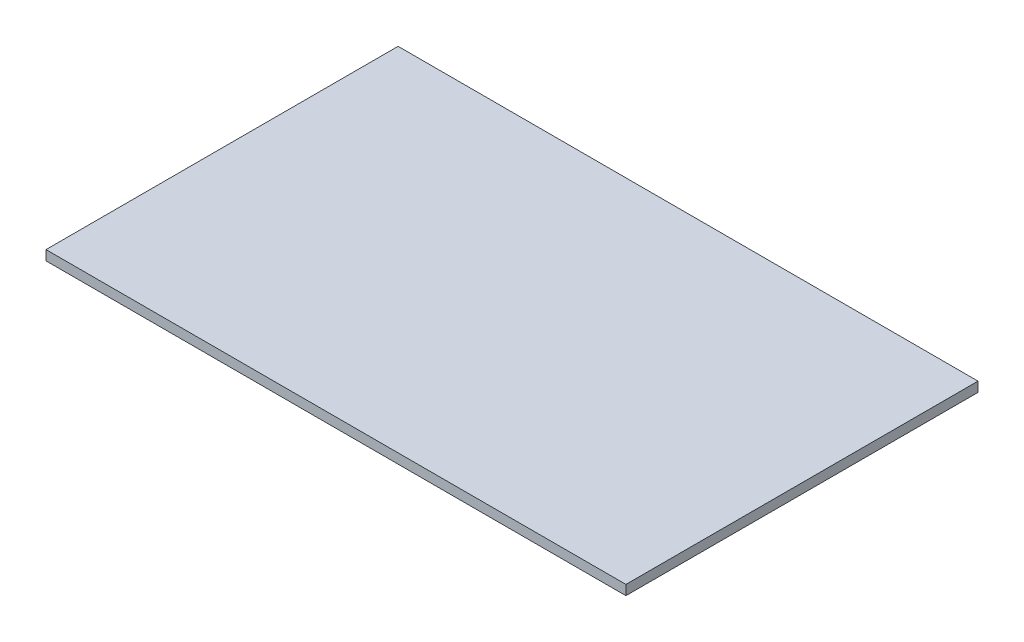
ISO-10303-21;
HEADER;
FILE_DESCRIPTION(('STEP AP214'),'2;1');
FILE_NAME('part.step','',(''),(''),'','','');
FILE_SCHEMA(('AUTOMOTIVE_DESIGN { 1 0 10303 214 1 1 1 1 }'));
ENDSEC;
DATA;
#1=APPLICATION_CONTEXT('core data for automotive mechanical design processes');
#2=APPLICATION_PROTOCOL_DEFINITION('international standard','automotive_design',2000,#1);
#3=PRODUCT_CONTEXT('',#1,'mechanical');
#4=PRODUCT('Part','Part','',(#3));
#5=PRODUCT_RELATED_PRODUCT_CATEGORY('part','',(#4));
#6=PRODUCT_DEFINITION_FORMATION('','',#4);
#7=PRODUCT_DEFINITION_CONTEXT('part definition',#1,'design');
#8=PRODUCT_DEFINITION('design','',#6,#7);
#9=PRODUCT_DEFINITION_SHAPE('','',#8);
#10=(LENGTH_UNIT() NAMED_UNIT(*) SI_UNIT(.MILLI.,.METRE.));
#11=(NAMED_UNIT(*) PLANE_ANGLE_UNIT() SI_UNIT($,.RADIAN.));
#12=(NAMED_UNIT(*) SI_UNIT($,.STERADIAN.) SOLID_ANGLE_UNIT());
#13=UNCERTAINTY_MEASURE_WITH_UNIT(LENGTH_MEASURE(1.E-05),#10,'distance_accuracy_value','');
#14=(GEOMETRIC_REPRESENTATION_CONTEXT(3) GLOBAL_UNCERTAINTY_ASSIGNED_CONTEXT((#13)) GLOBAL_UNIT_ASSIGNED_CONTEXT((#10,
#11,#12)) REPRESENTATION_CONTEXT('',''));
#15=CARTESIAN_POINT('',(0.,0.,0.));
#16=DIRECTION('',(0.,0.,1.));
#17=DIRECTION('',(1.,0.,0.));
#18=AXIS2_PLACEMENT_3D('',#15,#16,#17);
#19=CARTESIAN_POINT('',(-177.8,6.,107.95));
#20=DIRECTION('',(0.,0.,-1.));
#21=DIRECTION('',(-1.,0.,0.));
#22=AXIS2_PLACEMENT_3D('',#19,#20,#21);
#23=PLANE('',#22);
#24=DIRECTION('',(1.,0.,0.));
#25=VECTOR('',#24,1.);
#26=CARTESIAN_POINT('',(-177.8,0.,107.95));
#27=LINE('',#26,#25);
#28=CARTESIAN_POINT('',(-177.8,0.,107.95));
#29=VERTEX_POINT('',#28);
#30=CARTESIAN_POINT('',(177.8,0.,107.95));
#31=VERTEX_POINT('',#30);
#32=EDGE_CURVE('E105',#29,#31,#27,.T.);
#33=ORIENTED_EDGE('',*,*,#32,.T.);
#34=DIRECTION('',(0.,-1.,0.));
#35=VECTOR('',#34,1.);
#36=CARTESIAN_POINT('',(177.8,6.,107.95));
#37=LINE('',#36,#35);
#38=CARTESIAN_POINT('',(177.8,6.,107.95));
#39=VERTEX_POINT('',#38);
#40=EDGE_CURVE('E11',#39,#31,#37,.T.);
#41=ORIENTED_EDGE('',*,*,#40,.F.);
#42=DIRECTION('',(1.,0.,0.));
#43=VECTOR('',#42,1.);
#44=CARTESIAN_POINT('',(-177.8,6.,107.95));
#45=LINE('',#44,#43);
#46=CARTESIAN_POINT('',(-177.8,6.,107.95));
#47=VERTEX_POINT('',#46);
#48=EDGE_CURVE('E88',#47,#39,#45,.T.);
#49=ORIENTED_EDGE('',*,*,#48,.F.);
#50=DIRECTION('',(0.,-1.,0.));
#51=VECTOR('',#50,1.);
#52=CARTESIAN_POINT('',(-177.8,6.,107.95));
#53=LINE('',#52,#51);
#54=EDGE_CURVE('E54',#47,#29,#53,.T.);
#55=ORIENTED_EDGE('',*,*,#54,.T.);
#56=EDGE_LOOP('',(#33,#41,#49,#55));
#57=FACE_BOUND('',#56,.T.);
#58=ADVANCED_FACE('F39',(#57),#23,.F.);
#59=CARTESIAN_POINT('',(177.8,6.,107.95));
#60=DIRECTION('',(-1.,0.,0.));
#61=DIRECTION('',(0.,0.,1.));
#62=AXIS2_PLACEMENT_3D('',#59,#60,#61);
#63=PLANE('',#62);
#64=DIRECTION('',(0.,0.,-1.));
#65=VECTOR('',#64,1.);
#66=CARTESIAN_POINT('',(177.8,0.,107.95));
#67=LINE('',#66,#65);
#68=CARTESIAN_POINT('',(177.8,0.,-107.95));
#69=VERTEX_POINT('',#68);
#70=EDGE_CURVE('E93',#31,#69,#67,.T.);
#71=ORIENTED_EDGE('',*,*,#70,.T.);
#72=DIRECTION('',(0.,-1.,0.));
#73=VECTOR('',#72,1.);
#74=CARTESIAN_POINT('',(177.8,6.,-107.95));
#75=LINE('',#74,#73);
#76=CARTESIAN_POINT('',(177.8,6.,-107.95));
#77=VERTEX_POINT('',#76);
#78=EDGE_CURVE('E50',#77,#69,#75,.T.);
#79=ORIENTED_EDGE('',*,*,#78,.F.);
#80=DIRECTION('',(0.,0.,-1.));
#81=VECTOR('',#80,1.);
#82=CARTESIAN_POINT('',(177.8,6.,107.95));
#83=LINE('',#82,#81);
#84=EDGE_CURVE('E79',#39,#77,#83,.T.);
#85=ORIENTED_EDGE('',*,*,#84,.F.);
#86=ORIENTED_EDGE('',*,*,#40,.T.);
#87=EDGE_LOOP('',(#71,#79,#85,#86));
#88=FACE_BOUND('',#87,.T.);
#89=ADVANCED_FACE('F95',(#88),#63,.F.);
#90=CARTESIAN_POINT('',(-177.8,6.,-107.95));
#91=DIRECTION('',(0.,0.,-1.));
#92=DIRECTION('',(-1.,0.,0.));
#93=AXIS2_PLACEMENT_3D('',#90,#91,#92);
#94=PLANE('',#93);
#95=DIRECTION('',(1.,0.,0.));
#96=VECTOR('',#95,1.);
#97=CARTESIAN_POINT('',(-177.8,0.,-107.95));
#98=LINE('',#97,#96);
#99=CARTESIAN_POINT('',(-177.8,0.,-107.95));
#100=VERTEX_POINT('',#99);
#101=EDGE_CURVE('E103',#100,#69,#98,.T.);
#102=ORIENTED_EDGE('',*,*,#101,.F.);
#103=DIRECTION('',(0.,-1.,0.));
#104=VECTOR('',#103,1.);
#105=CARTESIAN_POINT('',(-177.8,6.,-107.95));
#106=LINE('',#105,#104);
#107=CARTESIAN_POINT('',(-177.8,6.,-107.95));
#108=VERTEX_POINT('',#107);
#109=EDGE_CURVE('E69',#108,#100,#106,.T.);
#110=ORIENTED_EDGE('',*,*,#109,.F.);
#111=DIRECTION('',(1.,0.,0.));
#112=VECTOR('',#111,1.);
#113=CARTESIAN_POINT('',(-177.8,6.,-107.95));
#114=LINE('',#113,#112);
#115=EDGE_CURVE('E90',#108,#77,#114,.T.);
#116=ORIENTED_EDGE('',*,*,#115,.T.);
#117=ORIENTED_EDGE('',*,*,#78,.T.);
#118=EDGE_LOOP('',(#102,#110,#116,#117));
#119=FACE_BOUND('',#118,.T.);
#120=ADVANCED_FACE('F96',(#119),#94,.T.);
#121=CARTESIAN_POINT('',(-177.8,6.,107.95));
#122=DIRECTION('',(-1.,0.,0.));
#123=DIRECTION('',(0.,0.,1.));
#124=AXIS2_PLACEMENT_3D('',#121,#122,#123);
#125=PLANE('',#124);
#126=DIRECTION('',(0.,0.,-1.));
#127=VECTOR('',#126,1.);
#128=CARTESIAN_POINT('',(-177.8,0.,107.95));
#129=LINE('',#128,#127);
#130=EDGE_CURVE('E107',#29,#100,#129,.T.);
#131=ORIENTED_EDGE('',*,*,#130,.F.);
#132=ORIENTED_EDGE('',*,*,#54,.F.);
#133=DIRECTION('',(0.,0.,-1.));
#134=VECTOR('',#133,1.);
#135=CARTESIAN_POINT('',(-177.8,6.,107.95));
#136=LINE('',#135,#134);
#137=EDGE_CURVE('E100',#47,#108,#136,.T.);
#138=ORIENTED_EDGE('',*,*,#137,.T.);
#139=ORIENTED_EDGE('',*,*,#109,.T.);
#140=EDGE_LOOP('',(#131,#132,#138,#139));
#141=FACE_BOUND('',#140,.T.);
#142=ADVANCED_FACE('F111',(#141),#125,.T.);
#143=CARTESIAN_POINT('',(0.,6.,0.));
#144=DIRECTION('',(0.,1.,0.));
#145=DIRECTION('',(0.,0.,1.));
#146=AXIS2_PLACEMENT_3D('',#143,#144,#145);
#147=PLANE('',#146);
#148=ORIENTED_EDGE('',*,*,#48,.T.);
#149=ORIENTED_EDGE('',*,*,#84,.T.);
#150=ORIENTED_EDGE('',*,*,#115,.F.);
#151=ORIENTED_EDGE('',*,*,#137,.F.);
#152=EDGE_LOOP('',(#148,#149,#150,#151));
#153=FACE_BOUND('',#152,.T.);
#154=ADVANCED_FACE('F84',(#153),#147,.T.);
#155=CARTESIAN_POINT('',(0.,0.,0.));
#156=DIRECTION('',(0.,1.,0.));
#157=DIRECTION('',(0.,0.,1.));
#158=AXIS2_PLACEMENT_3D('',#155,#156,#157);
#159=PLANE('',#158);
#160=ORIENTED_EDGE('',*,*,#32,.F.);
#161=ORIENTED_EDGE('',*,*,#130,.T.);
#162=ORIENTED_EDGE('',*,*,#101,.T.);
#163=ORIENTED_EDGE('',*,*,#70,.F.);
#164=EDGE_LOOP('',(#160,#161,#162,#163));
#165=FACE_BOUND('',#164,.T.);
#166=ADVANCED_FACE('F115',(#165),#159,.F.);
#167=CLOSED_SHELL('',(#58,#89,#120,#142,#154,#166));
#168=MANIFOLD_SOLID_BREP('B2',#167);
#169=ADVANCED_BREP_SHAPE_REPRESENTATION('',(#18,#168),#14);
#170=SHAPE_DEFINITION_REPRESENTATION(#9,#169);
ENDSEC;
END-ISO-10303-21;
